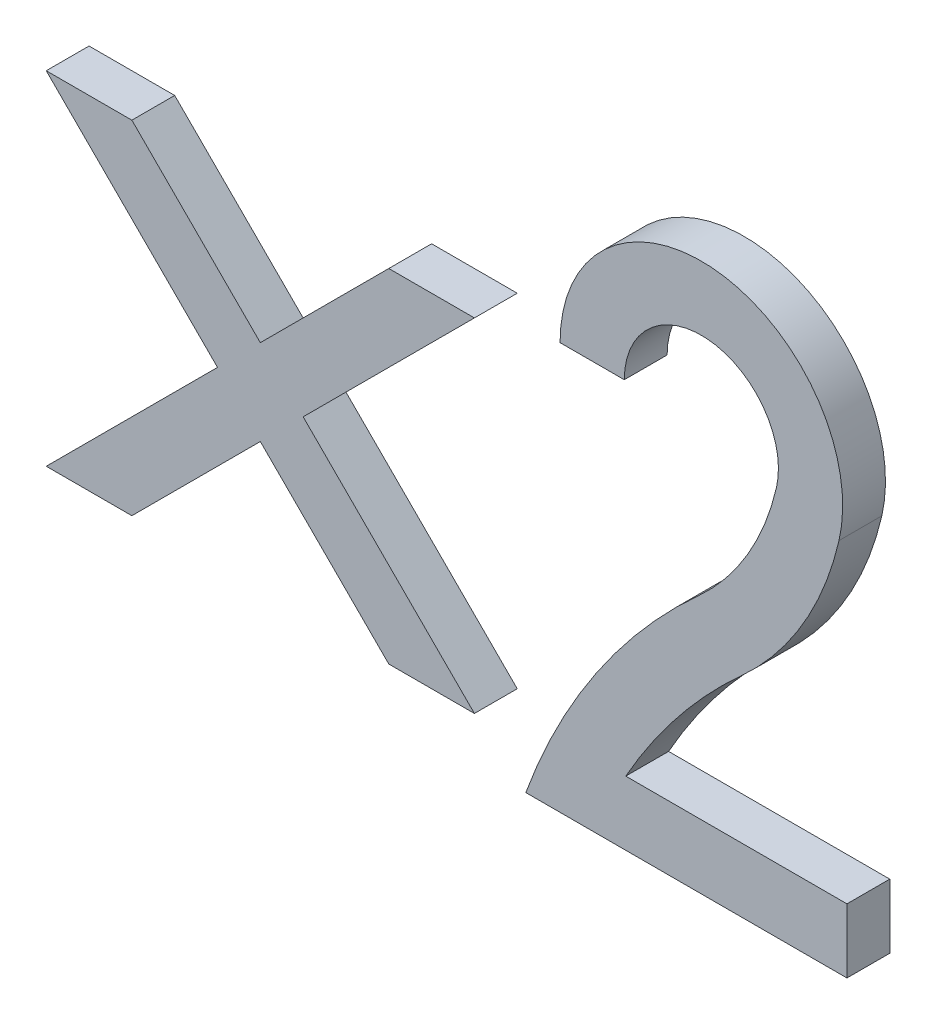
ISO-10303-21;
HEADER;
FILE_DESCRIPTION(('STEP AP214'),'2;1');
FILE_NAME('part.step','',(''),(''),'','','');
FILE_SCHEMA(('AUTOMOTIVE_DESIGN { 1 0 10303 214 1 1 1 1 }'));
ENDSEC;
DATA;
#1=APPLICATION_CONTEXT('core data for automotive mechanical design processes');
#2=APPLICATION_PROTOCOL_DEFINITION('international standard','automotive_design',2000,#1);
#3=PRODUCT_CONTEXT('',#1,'mechanical');
#4=PRODUCT('Part','Part','',(#3));
#5=PRODUCT_RELATED_PRODUCT_CATEGORY('part','',(#4));
#6=PRODUCT_DEFINITION_FORMATION('','',#4);
#7=PRODUCT_DEFINITION_CONTEXT('part definition',#1,'design');
#8=PRODUCT_DEFINITION('design','',#6,#7);
#9=PRODUCT_DEFINITION_SHAPE('','',#8);
#10=(LENGTH_UNIT() NAMED_UNIT(*) SI_UNIT(.MILLI.,.METRE.));
#11=(NAMED_UNIT(*) PLANE_ANGLE_UNIT() SI_UNIT($,.RADIAN.));
#12=(NAMED_UNIT(*) SI_UNIT($,.STERADIAN.) SOLID_ANGLE_UNIT());
#13=UNCERTAINTY_MEASURE_WITH_UNIT(LENGTH_MEASURE(1.E-05),#10,'distance_accuracy_value','');
#14=(GEOMETRIC_REPRESENTATION_CONTEXT(3) GLOBAL_UNCERTAINTY_ASSIGNED_CONTEXT((#13)) GLOBAL_UNIT_ASSIGNED_CONTEXT((#10,
#11,#12)) REPRESENTATION_CONTEXT('',''));
#15=CARTESIAN_POINT('',(0.,0.,0.));
#16=DIRECTION('',(0.,0.,1.));
#17=DIRECTION('',(1.,0.,0.));
#18=AXIS2_PLACEMENT_3D('',#15,#16,#17);
#19=CARTESIAN_POINT('',(103.,45.,10.));
#20=DIRECTION('',(0.,0.,-1.));
#21=DIRECTION('',(-1.,0.,0.));
#22=AXIS2_PLACEMENT_3D('',#19,#20,#21);
#23=CYLINDRICAL_SURFACE('',#22,18.);
#24=CARTESIAN_POINT('',(103.,45.,0.));
#25=DIRECTION('',(0.,0.,-1.));
#26=DIRECTION('',(-1.,0.,0.));
#27=AXIS2_PLACEMENT_3D('',#24,#25,#26);
#28=CIRCLE('',#27,18.);
#29=CARTESIAN_POINT('',(85.,45.,0.));
#30=VERTEX_POINT('',#29);
#31=CARTESIAN_POINT('',(120.53434356361,40.9322247120448,0.));
#32=VERTEX_POINT('',#31);
#33=EDGE_CURVE('E151',#30,#32,#28,.T.);
#34=ORIENTED_EDGE('',*,*,#33,.T.);
#35=DIRECTION('',(0.,0.,-1.));
#36=VECTOR('',#35,1.);
#37=CARTESIAN_POINT('',(120.53434356361,40.9322247120448,10.));
#38=LINE('',#37,#36);
#39=CARTESIAN_POINT('',(120.53434356361,40.9322247120448,10.));
#40=VERTEX_POINT('',#39);
#41=EDGE_CURVE('E12',#40,#32,#38,.T.);
#42=ORIENTED_EDGE('',*,*,#41,.F.);
#43=CARTESIAN_POINT('',(103.,45.,10.));
#44=DIRECTION('',(0.,0.,-1.));
#45=DIRECTION('',(-1.,0.,0.));
#46=AXIS2_PLACEMENT_3D('',#43,#44,#45);
#47=CIRCLE('',#46,18.);
#48=CARTESIAN_POINT('',(85.,45.,10.));
#49=VERTEX_POINT('',#48);
#50=EDGE_CURVE('E169',#49,#40,#47,.T.);
#51=ORIENTED_EDGE('',*,*,#50,.F.);
#52=DIRECTION('',(0.,0.,-1.));
#53=VECTOR('',#52,1.);
#54=CARTESIAN_POINT('',(85.,45.,10.));
#55=LINE('',#54,#53);
#56=EDGE_CURVE('E147',#49,#30,#55,.T.);
#57=ORIENTED_EDGE('',*,*,#56,.T.);
#58=EDGE_LOOP('',(#34,#42,#51,#57));
#59=FACE_BOUND('',#58,.T.);
#60=ADVANCED_FACE('F43',(#59),#23,.F.);
#61=CARTESIAN_POINT('',(62.0865316849107,54.4914756718954,10.));
#62=DIRECTION('',(0.,0.,-1.));
#63=DIRECTION('',(-1.,0.,0.));
#64=AXIS2_PLACEMENT_3D('',#61,#62,#63);
#65=CYLINDRICAL_SURFACE('',#64,60.);
#66=CARTESIAN_POINT('',(62.0865316849107,54.4914756718954,0.));
#67=DIRECTION('',(0.,0.,-1.));
#68=DIRECTION('',(-1.,0.,0.));
#69=AXIS2_PLACEMENT_3D('',#66,#67,#68);
#70=CIRCLE('',#69,60.);
#71=CARTESIAN_POINT('',(102.342072825692,9.99999999999999,0.));
#72=VERTEX_POINT('',#71);
#73=EDGE_CURVE('E154',#32,#72,#70,.T.);
#74=ORIENTED_EDGE('',*,*,#73,.T.);
#75=DIRECTION('',(0.,0.,-1.));
#76=VECTOR('',#75,1.);
#77=CARTESIAN_POINT('',(102.342072825692,9.99999999999999,10.));
#78=LINE('',#77,#76);
#79=CARTESIAN_POINT('',(102.342072825692,9.99999999999999,10.));
#80=VERTEX_POINT('',#79);
#81=EDGE_CURVE('E51',#80,#72,#78,.T.);
#82=ORIENTED_EDGE('',*,*,#81,.F.);
#83=CARTESIAN_POINT('',(62.0865316849107,54.4914756718954,10.));
#84=DIRECTION('',(0.,0.,-1.));
#85=DIRECTION('',(-1.,0.,0.));
#86=AXIS2_PLACEMENT_3D('',#83,#84,#85);
#87=CIRCLE('',#86,60.);
#88=EDGE_CURVE('E108',#40,#80,#87,.T.);
#89=ORIENTED_EDGE('',*,*,#88,.F.);
#90=ORIENTED_EDGE('',*,*,#41,.T.);
#91=EDGE_LOOP('',(#74,#82,#89,#90));
#92=FACE_BOUND('',#91,.T.);
#93=ADVANCED_FACE('F218',(#92),#65,.F.);
#94=CARTESIAN_POINT('',(202.980925677645,-101.228689179739,10.));
#95=DIRECTION('',(0.,0.,-1.));
#96=DIRECTION('',(-1.,0.,0.));
#97=AXIS2_PLACEMENT_3D('',#94,#95,#96);
#98=CYLINDRICAL_SURFACE('',#97,150.);
#99=CARTESIAN_POINT('',(202.980925677645,-101.228689179739,0.));
#100=DIRECTION('',(0.,0.,1.));
#101=DIRECTION('',(1.,0.,0.));
#102=AXIS2_PLACEMENT_3D('',#99,#100,#101);
#103=CIRCLE('',#102,150.);
#104=CARTESIAN_POINT('',(62.,-50.,0.));
#105=VERTEX_POINT('',#104);
#106=EDGE_CURVE('E156',#72,#105,#103,.T.);
#107=ORIENTED_EDGE('',*,*,#106,.T.);
#108=DIRECTION('',(0.,0.,-1.));
#109=VECTOR('',#108,1.);
#110=CARTESIAN_POINT('',(62.,-50.,10.));
#111=LINE('',#110,#109);
#112=CARTESIAN_POINT('',(62.,-50.,10.));
#113=VERTEX_POINT('',#112);
#114=EDGE_CURVE('E182',#113,#105,#111,.T.);
#115=ORIENTED_EDGE('',*,*,#114,.F.);
#116=CARTESIAN_POINT('',(202.980925677645,-101.228689179739,10.));
#117=DIRECTION('',(0.,0.,1.));
#118=DIRECTION('',(1.,0.,0.));
#119=AXIS2_PLACEMENT_3D('',#116,#117,#118);
#120=CIRCLE('',#119,150.);
#121=EDGE_CURVE('E190',#80,#113,#120,.T.);
#122=ORIENTED_EDGE('',*,*,#121,.F.);
#123=ORIENTED_EDGE('',*,*,#81,.T.);
#124=EDGE_LOOP('',(#107,#115,#122,#123));
#125=FACE_BOUND('',#124,.T.);
#126=ADVANCED_FACE('F188',(#125),#98,.T.);
#127=CARTESIAN_POINT('',(62.,-50.,10.));
#128=DIRECTION('',(0.,1.,0.));
#129=DIRECTION('',(0.,0.,1.));
#130=AXIS2_PLACEMENT_3D('',#127,#128,#129);
#131=PLANE('',#130);
#132=DIRECTION('',(1.,0.,0.));
#133=VECTOR('',#132,1.);
#134=CARTESIAN_POINT('',(62.,-50.,0.));
#135=LINE('',#134,#133);
#136=CARTESIAN_POINT('',(137.,-50.,0.));
#137=VERTEX_POINT('',#136);
#138=EDGE_CURVE('E158',#105,#137,#135,.T.);
#139=ORIENTED_EDGE('',*,*,#138,.T.);
#140=DIRECTION('',(0.,0.,-1.));
#141=VECTOR('',#140,1.);
#142=CARTESIAN_POINT('',(137.,-50.,10.));
#143=LINE('',#142,#141);
#144=CARTESIAN_POINT('',(137.,-50.,10.));
#145=VERTEX_POINT('',#144);
#146=EDGE_CURVE('E179',#145,#137,#143,.T.);
#147=ORIENTED_EDGE('',*,*,#146,.F.);
#148=DIRECTION('',(1.,0.,0.));
#149=VECTOR('',#148,1.);
#150=CARTESIAN_POINT('',(62.,-50.,10.));
#151=LINE('',#150,#149);
#152=EDGE_CURVE('E208',#113,#145,#151,.T.);
#153=ORIENTED_EDGE('',*,*,#152,.F.);
#154=ORIENTED_EDGE('',*,*,#114,.T.);
#155=EDGE_LOOP('',(#139,#147,#153,#154));
#156=FACE_BOUND('',#155,.T.);
#157=ADVANCED_FACE('F199',(#156),#131,.F.);
#158=CARTESIAN_POINT('',(137.,-50.,10.));
#159=DIRECTION('',(-1.,0.,0.));
#160=DIRECTION('',(0.,0.,1.));
#161=AXIS2_PLACEMENT_3D('',#158,#159,#160);
#162=PLANE('',#161);
#163=DIRECTION('',(0.,1.,0.));
#164=VECTOR('',#163,1.);
#165=CARTESIAN_POINT('',(137.,-50.,0.));
#166=LINE('',#165,#164);
#167=CARTESIAN_POINT('',(137.,-35.,0.));
#168=VERTEX_POINT('',#167);
#169=EDGE_CURVE('E160',#137,#168,#166,.T.);
#170=ORIENTED_EDGE('',*,*,#169,.T.);
#171=DIRECTION('',(0.,0.,-1.));
#172=VECTOR('',#171,1.);
#173=CARTESIAN_POINT('',(137.,-35.,10.));
#174=LINE('',#173,#172);
#175=CARTESIAN_POINT('',(137.,-35.,10.));
#176=VERTEX_POINT('',#175);
#177=EDGE_CURVE('E176',#176,#168,#174,.T.);
#178=ORIENTED_EDGE('',*,*,#177,.F.);
#179=DIRECTION('',(0.,1.,0.));
#180=VECTOR('',#179,1.);
#181=CARTESIAN_POINT('',(137.,-50.,10.));
#182=LINE('',#181,#180);
#183=EDGE_CURVE('E205',#145,#176,#182,.T.);
#184=ORIENTED_EDGE('',*,*,#183,.F.);
#185=ORIENTED_EDGE('',*,*,#146,.T.);
#186=EDGE_LOOP('',(#170,#178,#184,#185));
#187=FACE_BOUND('',#186,.T.);
#188=ADVANCED_FACE('F203',(#187),#162,.F.);
#189=CARTESIAN_POINT('',(85.3426634942316,-35.,10.));
#190=DIRECTION('',(0.,-1.,0.));
#191=DIRECTION('',(1.,0.,0.));
#192=AXIS2_PLACEMENT_3D('',#189,#190,#191);
#193=PLANE('',#192);
#194=DIRECTION('',(-1.,0.,0.));
#195=VECTOR('',#194,1.);
#196=CARTESIAN_POINT('',(85.3426634942316,-35.,0.));
#197=LINE('',#196,#195);
#198=CARTESIAN_POINT('',(85.3426634942316,-35.,0.));
#199=VERTEX_POINT('',#198);
#200=EDGE_CURVE('E162',#168,#199,#197,.T.);
#201=ORIENTED_EDGE('',*,*,#200,.T.);
#202=DIRECTION('',(0.,0.,-1.));
#203=VECTOR('',#202,1.);
#204=CARTESIAN_POINT('',(85.3426634942316,-35.,10.));
#205=LINE('',#204,#203);
#206=CARTESIAN_POINT('',(85.3426634942316,-35.,10.));
#207=VERTEX_POINT('',#206);
#208=EDGE_CURVE('E173',#207,#199,#205,.T.);
#209=ORIENTED_EDGE('',*,*,#208,.F.);
#210=DIRECTION('',(-1.,0.,0.));
#211=VECTOR('',#210,1.);
#212=CARTESIAN_POINT('',(85.3426634942316,-35.,10.));
#213=LINE('',#212,#211);
#214=EDGE_CURVE('E207',#176,#207,#213,.T.);
#215=ORIENTED_EDGE('',*,*,#214,.F.);
#216=ORIENTED_EDGE('',*,*,#177,.T.);
#217=EDGE_LOOP('',(#201,#209,#215,#216));
#218=FACE_BOUND('',#217,.T.);
#219=ADVANCED_FACE('F230',(#218),#193,.F.);
#220=CARTESIAN_POINT('',(202.980925677645,-101.228689179739,10.));
#221=DIRECTION('',(0.,0.,-1.));
#222=DIRECTION('',(-1.,0.,0.));
#223=AXIS2_PLACEMENT_3D('',#220,#221,#222);
#224=CYLINDRICAL_SURFACE('',#223,135.);
#225=CARTESIAN_POINT('',(202.980925677645,-101.228689179739,0.));
#226=DIRECTION('',(0.,0.,-1.));
#227=DIRECTION('',(1.,0.,0.));
#228=AXIS2_PLACEMENT_3D('',#225,#226,#227);
#229=CIRCLE('',#228,135.);
#230=CARTESIAN_POINT('',(112.405958110887,-1.1228689179739,0.));
#231=VERTEX_POINT('',#230);
#232=EDGE_CURVE('E164',#199,#231,#229,.T.);
#233=ORIENTED_EDGE('',*,*,#232,.T.);
#234=DIRECTION('',(0.,0.,-1.));
#235=VECTOR('',#234,1.);
#236=CARTESIAN_POINT('',(112.405958110887,-1.1228689179739,10.));
#237=LINE('',#236,#235);
#238=CARTESIAN_POINT('',(112.405958110887,-1.1228689179739,10.));
#239=VERTEX_POINT('',#238);
#240=EDGE_CURVE('E142',#239,#231,#237,.T.);
#241=ORIENTED_EDGE('',*,*,#240,.F.);
#242=CARTESIAN_POINT('',(202.980925677645,-101.228689179739,10.));
#243=DIRECTION('',(0.,0.,-1.));
#244=DIRECTION('',(1.,0.,0.));
#245=AXIS2_PLACEMENT_3D('',#242,#243,#244);
#246=CIRCLE('',#245,135.);
#247=EDGE_CURVE('E133',#207,#239,#246,.T.);
#248=ORIENTED_EDGE('',*,*,#247,.F.);
#249=ORIENTED_EDGE('',*,*,#208,.T.);
#250=EDGE_LOOP('',(#233,#241,#248,#249));
#251=FACE_BOUND('',#250,.T.);
#252=ADVANCED_FACE('F233',(#251),#224,.F.);
#253=CARTESIAN_POINT('',(62.0865316849107,54.4914756718954,10.));
#254=DIRECTION('',(0.,0.,-1.));
#255=DIRECTION('',(-1.,0.,0.));
#256=AXIS2_PLACEMENT_3D('',#253,#254,#255);
#257=CYLINDRICAL_SURFACE('',#256,75.);
#258=CARTESIAN_POINT('',(62.0865316849107,54.4914756718954,0.));
#259=DIRECTION('',(0.,0.,1.));
#260=DIRECTION('',(-1.,0.,0.));
#261=AXIS2_PLACEMENT_3D('',#258,#259,#260);
#262=CIRCLE('',#261,75.);
#263=CARTESIAN_POINT('',(135.146296533284,37.5424119720821,0.));
#264=VERTEX_POINT('',#263);
#265=EDGE_CURVE('E141',#231,#264,#262,.T.);
#266=ORIENTED_EDGE('',*,*,#265,.T.);
#267=DIRECTION('',(0.,0.,-1.));
#268=VECTOR('',#267,1.);
#269=CARTESIAN_POINT('',(135.146296533284,37.5424119720821,10.));
#270=LINE('',#269,#268);
#271=CARTESIAN_POINT('',(135.146296533284,37.5424119720821,10.));
#272=VERTEX_POINT('',#271);
#273=EDGE_CURVE('E138',#272,#264,#270,.T.);
#274=ORIENTED_EDGE('',*,*,#273,.F.);
#275=CARTESIAN_POINT('',(62.0865316849107,54.4914756718954,10.));
#276=DIRECTION('',(0.,0.,1.));
#277=DIRECTION('',(-1.,0.,0.));
#278=AXIS2_PLACEMENT_3D('',#275,#276,#277);
#279=CIRCLE('',#278,75.);
#280=EDGE_CURVE('E127',#239,#272,#279,.T.);
#281=ORIENTED_EDGE('',*,*,#280,.F.);
#282=ORIENTED_EDGE('',*,*,#240,.T.);
#283=EDGE_LOOP('',(#266,#274,#281,#282));
#284=FACE_BOUND('',#283,.T.);
#285=ADVANCED_FACE('F139',(#284),#257,.T.);
#286=CARTESIAN_POINT('',(103.,45.,10.));
#287=DIRECTION('',(0.,0.,-1.));
#288=DIRECTION('',(-1.,0.,0.));
#289=AXIS2_PLACEMENT_3D('',#286,#287,#288);
#290=CYLINDRICAL_SURFACE('',#289,33.);
#291=CARTESIAN_POINT('',(103.,45.,0.));
#292=DIRECTION('',(0.,0.,1.));
#293=DIRECTION('',(-1.,0.,0.));
#294=AXIS2_PLACEMENT_3D('',#291,#292,#293);
#295=CIRCLE('',#294,33.);
#296=CARTESIAN_POINT('',(70.,45.,0.));
#297=VERTEX_POINT('',#296);
#298=EDGE_CURVE('E94',#264,#297,#295,.T.);
#299=ORIENTED_EDGE('',*,*,#298,.T.);
#300=DIRECTION('',(0.,0.,-1.));
#301=VECTOR('',#300,1.);
#302=CARTESIAN_POINT('',(70.,45.,10.));
#303=LINE('',#302,#301);
#304=CARTESIAN_POINT('',(70.,45.,10.));
#305=VERTEX_POINT('',#304);
#306=EDGE_CURVE('E143',#305,#297,#303,.T.);
#307=ORIENTED_EDGE('',*,*,#306,.F.);
#308=CARTESIAN_POINT('',(103.,45.,10.));
#309=DIRECTION('',(0.,0.,1.));
#310=DIRECTION('',(-1.,0.,0.));
#311=AXIS2_PLACEMENT_3D('',#308,#309,#310);
#312=CIRCLE('',#311,33.);
#313=EDGE_CURVE('E131',#272,#305,#312,.T.);
#314=ORIENTED_EDGE('',*,*,#313,.F.);
#315=ORIENTED_EDGE('',*,*,#273,.T.);
#316=EDGE_LOOP('',(#299,#307,#314,#315));
#317=FACE_BOUND('',#316,.T.);
#318=ADVANCED_FACE('F145',(#317),#290,.T.);
#319=CARTESIAN_POINT('',(70.,45.,10.));
#320=DIRECTION('',(0.,1.,0.));
#321=DIRECTION('',(-1.,0.,0.));
#322=AXIS2_PLACEMENT_3D('',#319,#320,#321);
#323=PLANE('',#322);
#324=DIRECTION('',(1.,0.,0.));
#325=VECTOR('',#324,1.);
#326=CARTESIAN_POINT('',(70.,45.,0.));
#327=LINE('',#326,#325);
#328=EDGE_CURVE('E100',#297,#30,#327,.T.);
#329=ORIENTED_EDGE('',*,*,#328,.T.);
#330=ORIENTED_EDGE('',*,*,#56,.F.);
#331=DIRECTION('',(1.,0.,0.));
#332=VECTOR('',#331,1.);
#333=CARTESIAN_POINT('',(70.,45.,10.));
#334=LINE('',#333,#332);
#335=EDGE_CURVE('E59',#305,#49,#334,.T.);
#336=ORIENTED_EDGE('',*,*,#335,.F.);
#337=ORIENTED_EDGE('',*,*,#306,.T.);
#338=EDGE_LOOP('',(#329,#330,#336,#337));
#339=FACE_BOUND('',#338,.T.);
#340=ADVANCED_FACE('F242',(#339),#323,.F.);
#341=CARTESIAN_POINT('',(103.,45.,10.));
#342=DIRECTION('',(0.,0.,-1.));
#343=DIRECTION('',(-1.,0.,0.));
#344=AXIS2_PLACEMENT_3D('',#341,#342,#343);
#345=PLANE('',#344);
#346=ORIENTED_EDGE('',*,*,#50,.T.);
#347=ORIENTED_EDGE('',*,*,#88,.T.);
#348=ORIENTED_EDGE('',*,*,#121,.T.);
#349=ORIENTED_EDGE('',*,*,#152,.T.);
#350=ORIENTED_EDGE('',*,*,#183,.T.);
#351=ORIENTED_EDGE('',*,*,#214,.T.);
#352=ORIENTED_EDGE('',*,*,#247,.T.);
#353=ORIENTED_EDGE('',*,*,#280,.T.);
#354=ORIENTED_EDGE('',*,*,#313,.T.);
#355=ORIENTED_EDGE('',*,*,#335,.T.);
#356=EDGE_LOOP('',(#346,#347,#348,#349,#350,#351,#352,#353,#354,#355));
#357=FACE_BOUND('',#356,.T.);
#358=ADVANCED_FACE('F129',(#357),#345,.F.);
#359=CARTESIAN_POINT('',(103.,45.,0.));
#360=DIRECTION('',(0.,0.,-1.));
#361=DIRECTION('',(-1.,0.,0.));
#362=AXIS2_PLACEMENT_3D('',#359,#360,#361);
#363=PLANE('',#362);
#364=ORIENTED_EDGE('',*,*,#33,.F.);
#365=ORIENTED_EDGE('',*,*,#328,.F.);
#366=ORIENTED_EDGE('',*,*,#298,.F.);
#367=ORIENTED_EDGE('',*,*,#265,.F.);
#368=ORIENTED_EDGE('',*,*,#232,.F.);
#369=ORIENTED_EDGE('',*,*,#200,.F.);
#370=ORIENTED_EDGE('',*,*,#169,.F.);
#371=ORIENTED_EDGE('',*,*,#138,.F.);
#372=ORIENTED_EDGE('',*,*,#106,.F.);
#373=ORIENTED_EDGE('',*,*,#73,.F.);
#374=EDGE_LOOP('',(#364,#365,#366,#367,#368,#369,#370,#371,#372,#373));
#375=FACE_BOUND('',#374,.T.);
#376=ADVANCED_FACE('F194',(#375),#363,.T.);
#377=CLOSED_SHELL('',(#60,#93,#126,#157,#188,#219,#252,#285,#318,#340,#358,#376));
#378=MANIFOLD_SOLID_BREP('B2',#377);
#379=CARTESIAN_POINT('',(-30.,40.,10.));
#380=DIRECTION('',(0.,-1.,0.));
#381=DIRECTION('',(0.,0.,-1.));
#382=AXIS2_PLACEMENT_3D('',#379,#380,#381);
#383=PLANE('',#382);
#384=DIRECTION('',(-1.,0.,0.));
#385=VECTOR('',#384,1.);
#386=CARTESIAN_POINT('',(-30.,40.,0.));
#387=LINE('',#386,#385);
#388=CARTESIAN_POINT('',(-30.,40.,0.));
#389=VERTEX_POINT('',#388);
#390=CARTESIAN_POINT('',(-50.,40.,0.));
#391=VERTEX_POINT('',#390);
#392=EDGE_CURVE('E443',#389,#391,#387,.T.);
#393=ORIENTED_EDGE('',*,*,#392,.T.);
#394=DIRECTION('',(0.,0.,-1.));
#395=VECTOR('',#394,1.);
#396=CARTESIAN_POINT('',(-50.,40.,10.));
#397=LINE('',#396,#395);
#398=CARTESIAN_POINT('',(-50.,40.,10.));
#399=VERTEX_POINT('',#398);
#400=EDGE_CURVE('E41',#399,#391,#397,.T.);
#401=ORIENTED_EDGE('',*,*,#400,.F.);
#402=DIRECTION('',(-1.,0.,0.));
#403=VECTOR('',#402,1.);
#404=CARTESIAN_POINT('',(-30.,40.,10.));
#405=LINE('',#404,#403);
#406=CARTESIAN_POINT('',(-30.,40.,10.));
#407=VERTEX_POINT('',#406);
#408=EDGE_CURVE('E465',#407,#399,#405,.T.);
#409=ORIENTED_EDGE('',*,*,#408,.F.);
#410=DIRECTION('',(0.,0.,-1.));
#411=VECTOR('',#410,1.);
#412=CARTESIAN_POINT('',(-30.,40.,10.));
#413=LINE('',#412,#411);
#414=EDGE_CURVE('E439',#407,#389,#413,.T.);
#415=ORIENTED_EDGE('',*,*,#414,.T.);
#416=EDGE_LOOP('',(#393,#401,#409,#415));
#417=FACE_BOUND('',#416,.T.);
#418=ADVANCED_FACE('F323',(#417),#383,.F.);
#419=CARTESIAN_POINT('',(-50.,40.,10.));
#420=DIRECTION('',(0.707106781186547,0.707106781186548,0.));
#421=DIRECTION('',(-0.707106781186548,0.707106781186547,0.));
#422=AXIS2_PLACEMENT_3D('',#419,#420,#421);
#423=PLANE('',#422);
#424=DIRECTION('',(0.707106781186548,-0.707106781186547,0.));
#425=VECTOR('',#424,1.);
#426=CARTESIAN_POINT('',(-50.,40.,0.));
#427=LINE('',#426,#425);
#428=CARTESIAN_POINT('',(-10.,0.,0.));
#429=VERTEX_POINT('',#428);
#430=EDGE_CURVE('E446',#391,#429,#427,.T.);
#431=ORIENTED_EDGE('',*,*,#430,.T.);
#432=DIRECTION('',(0.,0.,-1.));
#433=VECTOR('',#432,1.);
#434=CARTESIAN_POINT('',(-10.,0.,10.));
#435=LINE('',#434,#433);
#436=CARTESIAN_POINT('',(-10.,0.,10.));
#437=VERTEX_POINT('',#436);
#438=EDGE_CURVE('E331',#437,#429,#435,.T.);
#439=ORIENTED_EDGE('',*,*,#438,.F.);
#440=DIRECTION('',(0.707106781186548,-0.707106781186547,0.));
#441=VECTOR('',#440,1.);
#442=CARTESIAN_POINT('',(-50.,40.,10.));
#443=LINE('',#442,#441);
#444=EDGE_CURVE('E394',#399,#437,#443,.T.);
#445=ORIENTED_EDGE('',*,*,#444,.F.);
#446=ORIENTED_EDGE('',*,*,#400,.T.);
#447=EDGE_LOOP('',(#431,#439,#445,#446));
#448=FACE_BOUND('',#447,.T.);
#449=ADVANCED_FACE('F543',(#448),#423,.F.);
#450=CARTESIAN_POINT('',(-50.,-40.,10.));
#451=DIRECTION('',(0.707106781186548,-0.707106781186548,0.));
#452=DIRECTION('',(0.707106781186548,0.707106781186548,0.));
#453=AXIS2_PLACEMENT_3D('',#450,#451,#452);
#454=PLANE('',#453);
#455=DIRECTION('',(-0.707106781186547,-0.707106781186547,0.));
#456=VECTOR('',#455,1.);
#457=CARTESIAN_POINT('',(-50.,-40.,0.));
#458=LINE('',#457,#456);
#459=CARTESIAN_POINT('',(-50.,-40.,0.));
#460=VERTEX_POINT('',#459);
#461=EDGE_CURVE('E448',#429,#460,#458,.T.);
#462=ORIENTED_EDGE('',*,*,#461,.T.);
#463=DIRECTION('',(0.,0.,-1.));
#464=VECTOR('',#463,1.);
#465=CARTESIAN_POINT('',(-50.,-40.,10.));
#466=LINE('',#465,#464);
#467=CARTESIAN_POINT('',(-50.,-40.,10.));
#468=VERTEX_POINT('',#467);
#469=EDGE_CURVE('E484',#468,#460,#466,.T.);
#470=ORIENTED_EDGE('',*,*,#469,.F.);
#471=DIRECTION('',(-0.707106781186547,-0.707106781186547,0.));
#472=VECTOR('',#471,1.);
#473=CARTESIAN_POINT('',(-50.,-40.,10.));
#474=LINE('',#473,#472);
#475=EDGE_CURVE('E492',#437,#468,#474,.T.);
#476=ORIENTED_EDGE('',*,*,#475,.F.);
#477=ORIENTED_EDGE('',*,*,#438,.T.);
#478=EDGE_LOOP('',(#462,#470,#476,#477));
#479=FACE_BOUND('',#478,.T.);
#480=ADVANCED_FACE('F490',(#479),#454,.F.);
#481=CARTESIAN_POINT('',(-29.9999999999999,-40.,10.));
#482=DIRECTION('',(0.,1.,0.));
#483=DIRECTION('',(0.,0.,1.));
#484=AXIS2_PLACEMENT_3D('',#481,#482,#483);
#485=PLANE('',#484);
#486=DIRECTION('',(1.,0.,0.));
#487=VECTOR('',#486,1.);
#488=CARTESIAN_POINT('',(-29.9999999999999,-40.,0.));
#489=LINE('',#488,#487);
#490=CARTESIAN_POINT('',(-29.9999999999999,-40.,0.));
#491=VERTEX_POINT('',#490);
#492=EDGE_CURVE('E450',#460,#491,#489,.T.);
#493=ORIENTED_EDGE('',*,*,#492,.T.);
#494=DIRECTION('',(0.,0.,-1.));
#495=VECTOR('',#494,1.);
#496=CARTESIAN_POINT('',(-29.9999999999999,-40.,10.));
#497=LINE('',#496,#495);
#498=CARTESIAN_POINT('',(-29.9999999999999,-40.,10.));
#499=VERTEX_POINT('',#498);
#500=EDGE_CURVE('E481',#499,#491,#497,.T.);
#501=ORIENTED_EDGE('',*,*,#500,.F.);
#502=DIRECTION('',(1.,0.,0.));
#503=VECTOR('',#502,1.);
#504=CARTESIAN_POINT('',(-29.9999999999999,-40.,10.));
#505=LINE('',#504,#503);
#506=EDGE_CURVE('E510',#468,#499,#505,.T.);
#507=ORIENTED_EDGE('',*,*,#506,.F.);
#508=ORIENTED_EDGE('',*,*,#469,.T.);
#509=EDGE_LOOP('',(#493,#501,#507,#508));
#510=FACE_BOUND('',#509,.T.);
#511=ADVANCED_FACE('F501',(#510),#485,.F.);
#512=CARTESIAN_POINT('',(0.,-10.,10.));
#513=DIRECTION('',(-0.707106781186548,0.707106781186547,0.));
#514=DIRECTION('',(-0.707106781186547,-0.707106781186548,0.));
#515=AXIS2_PLACEMENT_3D('',#512,#513,#514);
#516=PLANE('',#515);
#517=DIRECTION('',(0.707106781186547,0.707106781186548,0.));
#518=VECTOR('',#517,1.);
#519=CARTESIAN_POINT('',(0.,-10.,0.));
#520=LINE('',#519,#518);
#521=CARTESIAN_POINT('',(0.,-10.,0.));
#522=VERTEX_POINT('',#521);
#523=EDGE_CURVE('E452',#491,#522,#520,.T.);
#524=ORIENTED_EDGE('',*,*,#523,.T.);
#525=DIRECTION('',(0.,0.,-1.));
#526=VECTOR('',#525,1.);
#527=CARTESIAN_POINT('',(0.,-10.,10.));
#528=LINE('',#527,#526);
#529=CARTESIAN_POINT('',(0.,-10.,10.));
#530=VERTEX_POINT('',#529);
#531=EDGE_CURVE('E478',#530,#522,#528,.T.);
#532=ORIENTED_EDGE('',*,*,#531,.F.);
#533=DIRECTION('',(0.707106781186547,0.707106781186548,0.));
#534=VECTOR('',#533,1.);
#535=CARTESIAN_POINT('',(0.,-10.,10.));
#536=LINE('',#535,#534);
#537=EDGE_CURVE('E507',#499,#530,#536,.T.);
#538=ORIENTED_EDGE('',*,*,#537,.F.);
#539=ORIENTED_EDGE('',*,*,#500,.T.);
#540=EDGE_LOOP('',(#524,#532,#538,#539));
#541=FACE_BOUND('',#540,.T.);
#542=ADVANCED_FACE('F505',(#541),#516,.F.);
#543=CARTESIAN_POINT('',(0.,-10.,10.));
#544=DIRECTION('',(0.707106781186548,0.707106781186547,0.));
#545=DIRECTION('',(-0.707106781186547,0.707106781186548,0.));
#546=AXIS2_PLACEMENT_3D('',#543,#544,#545);
#547=PLANE('',#546);
#548=DIRECTION('',(0.707106781186547,-0.707106781186548,0.));
#549=VECTOR('',#548,1.);
#550=CARTESIAN_POINT('',(0.,-10.,0.));
#551=LINE('',#550,#549);
#552=CARTESIAN_POINT('',(30.,-40.,0.));
#553=VERTEX_POINT('',#552);
#554=EDGE_CURVE('E454',#522,#553,#551,.T.);
#555=ORIENTED_EDGE('',*,*,#554,.T.);
#556=DIRECTION('',(0.,0.,-1.));
#557=VECTOR('',#556,1.);
#558=CARTESIAN_POINT('',(30.,-40.,10.));
#559=LINE('',#558,#557);
#560=CARTESIAN_POINT('',(30.,-40.,10.));
#561=VERTEX_POINT('',#560);
#562=EDGE_CURVE('E475',#561,#553,#559,.T.);
#563=ORIENTED_EDGE('',*,*,#562,.F.);
#564=DIRECTION('',(0.707106781186547,-0.707106781186548,0.));
#565=VECTOR('',#564,1.);
#566=CARTESIAN_POINT('',(0.,-10.,10.));
#567=LINE('',#566,#565);
#568=EDGE_CURVE('E509',#530,#561,#567,.T.);
#569=ORIENTED_EDGE('',*,*,#568,.F.);
#570=ORIENTED_EDGE('',*,*,#531,.T.);
#571=EDGE_LOOP('',(#555,#563,#569,#570));
#572=FACE_BOUND('',#571,.T.);
#573=ADVANCED_FACE('F556',(#572),#547,.F.);
#574=CARTESIAN_POINT('',(30.,-40.,10.));
#575=DIRECTION('',(0.,1.,0.));
#576=DIRECTION('',(0.,0.,1.));
#577=AXIS2_PLACEMENT_3D('',#574,#575,#576);
#578=PLANE('',#577);
#579=DIRECTION('',(1.,0.,0.));
#580=VECTOR('',#579,1.);
#581=CARTESIAN_POINT('',(30.,-40.,0.));
#582=LINE('',#581,#580);
#583=CARTESIAN_POINT('',(50.,-40.,0.));
#584=VERTEX_POINT('',#583);
#585=EDGE_CURVE('E456',#553,#584,#582,.T.);
#586=ORIENTED_EDGE('',*,*,#585,.T.);
#587=DIRECTION('',(0.,0.,-1.));
#588=VECTOR('',#587,1.);
#589=CARTESIAN_POINT('',(50.,-40.,10.));
#590=LINE('',#589,#588);
#591=CARTESIAN_POINT('',(50.,-40.,10.));
#592=VERTEX_POINT('',#591);
#593=EDGE_CURVE('E472',#592,#584,#590,.T.);
#594=ORIENTED_EDGE('',*,*,#593,.F.);
#595=DIRECTION('',(1.,0.,0.));
#596=VECTOR('',#595,1.);
#597=CARTESIAN_POINT('',(30.,-40.,10.));
#598=LINE('',#597,#596);
#599=EDGE_CURVE('E512',#561,#592,#598,.T.);
#600=ORIENTED_EDGE('',*,*,#599,.F.);
#601=ORIENTED_EDGE('',*,*,#562,.T.);
#602=EDGE_LOOP('',(#586,#594,#600,#601));
#603=FACE_BOUND('',#602,.T.);
#604=ADVANCED_FACE('F559',(#603),#578,.F.);
#605=CARTESIAN_POINT('',(50.,-40.,10.));
#606=DIRECTION('',(-0.707106781186547,-0.707106781186548,0.));
#607=DIRECTION('',(0.707106781186548,-0.707106781186547,0.));
#608=AXIS2_PLACEMENT_3D('',#605,#606,#607);
#609=PLANE('',#608);
#610=DIRECTION('',(-0.707106781186548,0.707106781186547,0.));
#611=VECTOR('',#610,1.);
#612=CARTESIAN_POINT('',(50.,-40.,0.));
#613=LINE('',#612,#611);
#614=CARTESIAN_POINT('',(10.,0.,0.));
#615=VERTEX_POINT('',#614);
#616=EDGE_CURVE('E458',#584,#615,#613,.T.);
#617=ORIENTED_EDGE('',*,*,#616,.T.);
#618=DIRECTION('',(0.,0.,-1.));
#619=VECTOR('',#618,1.);
#620=CARTESIAN_POINT('',(10.,0.,10.));
#621=LINE('',#620,#619);
#622=CARTESIAN_POINT('',(10.,0.,10.));
#623=VERTEX_POINT('',#622);
#624=EDGE_CURVE('E469',#623,#615,#621,.T.);
#625=ORIENTED_EDGE('',*,*,#624,.F.);
#626=DIRECTION('',(-0.707106781186548,0.707106781186547,0.));
#627=VECTOR('',#626,1.);
#628=CARTESIAN_POINT('',(50.,-40.,10.));
#629=LINE('',#628,#627);
#630=EDGE_CURVE('E518',#592,#623,#629,.T.);
#631=ORIENTED_EDGE('',*,*,#630,.F.);
#632=ORIENTED_EDGE('',*,*,#593,.T.);
#633=EDGE_LOOP('',(#617,#625,#631,#632));
#634=FACE_BOUND('',#633,.T.);
#635=ADVANCED_FACE('F524',(#634),#609,.F.);
#636=CARTESIAN_POINT('',(50.,40.,10.));
#637=DIRECTION('',(-0.707106781186548,0.707106781186547,0.));
#638=DIRECTION('',(-0.707106781186547,-0.707106781186548,0.));
#639=AXIS2_PLACEMENT_3D('',#636,#637,#638);
#640=PLANE('',#639);
#641=DIRECTION('',(0.707106781186547,0.707106781186548,0.));
#642=VECTOR('',#641,1.);
#643=CARTESIAN_POINT('',(50.,40.,0.));
#644=LINE('',#643,#642);
#645=CARTESIAN_POINT('',(50.,40.,0.));
#646=VERTEX_POINT('',#645);
#647=EDGE_CURVE('E460',#615,#646,#644,.T.);
#648=ORIENTED_EDGE('',*,*,#647,.T.);
#649=DIRECTION('',(0.,0.,-1.));
#650=VECTOR('',#649,1.);
#651=CARTESIAN_POINT('',(50.,40.,10.));
#652=LINE('',#651,#650);
#653=CARTESIAN_POINT('',(50.,40.,10.));
#654=VERTEX_POINT('',#653);
#655=EDGE_CURVE('E434',#654,#646,#652,.T.);
#656=ORIENTED_EDGE('',*,*,#655,.F.);
#657=DIRECTION('',(0.707106781186547,0.707106781186548,0.));
#658=VECTOR('',#657,1.);
#659=CARTESIAN_POINT('',(50.,40.,10.));
#660=LINE('',#659,#658);
#661=EDGE_CURVE('E425',#623,#654,#660,.T.);
#662=ORIENTED_EDGE('',*,*,#661,.F.);
#663=ORIENTED_EDGE('',*,*,#624,.T.);
#664=EDGE_LOOP('',(#648,#656,#662,#663));
#665=FACE_BOUND('',#664,.T.);
#666=ADVANCED_FACE('F528',(#665),#640,.F.);
#667=CARTESIAN_POINT('',(30.,40.,10.));
#668=DIRECTION('',(0.,-1.,0.));
#669=DIRECTION('',(0.,0.,-1.));
#670=AXIS2_PLACEMENT_3D('',#667,#668,#669);
#671=PLANE('',#670);
#672=DIRECTION('',(-1.,0.,0.));
#673=VECTOR('',#672,1.);
#674=CARTESIAN_POINT('',(30.,40.,0.));
#675=LINE('',#674,#673);
#676=CARTESIAN_POINT('',(30.,40.,0.));
#677=VERTEX_POINT('',#676);
#678=EDGE_CURVE('E433',#646,#677,#675,.T.);
#679=ORIENTED_EDGE('',*,*,#678,.T.);
#680=DIRECTION('',(0.,0.,-1.));
#681=VECTOR('',#680,1.);
#682=CARTESIAN_POINT('',(30.,40.,10.));
#683=LINE('',#682,#681);
#684=CARTESIAN_POINT('',(30.,40.,10.));
#685=VERTEX_POINT('',#684);
#686=EDGE_CURVE('E430',#685,#677,#683,.T.);
#687=ORIENTED_EDGE('',*,*,#686,.F.);
#688=DIRECTION('',(-1.,0.,0.));
#689=VECTOR('',#688,1.);
#690=CARTESIAN_POINT('',(30.,40.,10.));
#691=LINE('',#690,#689);
#692=EDGE_CURVE('E419',#654,#685,#691,.T.);
#693=ORIENTED_EDGE('',*,*,#692,.F.);
#694=ORIENTED_EDGE('',*,*,#655,.T.);
#695=EDGE_LOOP('',(#679,#687,#693,#694));
#696=FACE_BOUND('',#695,.T.);
#697=ADVANCED_FACE('F431',(#696),#671,.F.);
#698=CARTESIAN_POINT('',(0.,10.,10.));
#699=DIRECTION('',(0.707106781186548,-0.707106781186547,0.));
#700=DIRECTION('',(0.707106781186547,0.707106781186548,0.));
#701=AXIS2_PLACEMENT_3D('',#698,#699,#700);
#702=PLANE('',#701);
#703=DIRECTION('',(-0.707106781186547,-0.707106781186548,0.));
#704=VECTOR('',#703,1.);
#705=CARTESIAN_POINT('',(0.,10.,0.));
#706=LINE('',#705,#704);
#707=CARTESIAN_POINT('',(0.,10.,0.));
#708=VERTEX_POINT('',#707);
#709=EDGE_CURVE('E380',#677,#708,#706,.T.);
#710=ORIENTED_EDGE('',*,*,#709,.T.);
#711=DIRECTION('',(0.,0.,-1.));
#712=VECTOR('',#711,1.);
#713=CARTESIAN_POINT('',(0.,10.,10.));
#714=LINE('',#713,#712);
#715=CARTESIAN_POINT('',(0.,10.,10.));
#716=VERTEX_POINT('',#715);
#717=EDGE_CURVE('E435',#716,#708,#714,.T.);
#718=ORIENTED_EDGE('',*,*,#717,.F.);
#719=DIRECTION('',(-0.707106781186547,-0.707106781186548,0.));
#720=VECTOR('',#719,1.);
#721=CARTESIAN_POINT('',(0.,10.,10.));
#722=LINE('',#721,#720);
#723=EDGE_CURVE('E423',#685,#716,#722,.T.);
#724=ORIENTED_EDGE('',*,*,#723,.F.);
#725=ORIENTED_EDGE('',*,*,#686,.T.);
#726=EDGE_LOOP('',(#710,#718,#724,#725));
#727=FACE_BOUND('',#726,.T.);
#728=ADVANCED_FACE('F437',(#727),#702,.F.);
#729=CARTESIAN_POINT('',(0.,10.,10.));
#730=DIRECTION('',(-0.707106781186547,-0.707106781186548,0.));
#731=DIRECTION('',(0.707106781186548,-0.707106781186547,0.));
#732=AXIS2_PLACEMENT_3D('',#729,#730,#731);
#733=PLANE('',#732);
#734=DIRECTION('',(-0.707106781186548,0.707106781186547,0.));
#735=VECTOR('',#734,1.);
#736=CARTESIAN_POINT('',(0.,10.,0.));
#737=LINE('',#736,#735);
#738=EDGE_CURVE('E386',#708,#389,#737,.T.);
#739=ORIENTED_EDGE('',*,*,#738,.T.);
#740=ORIENTED_EDGE('',*,*,#414,.F.);
#741=DIRECTION('',(-0.707106781186548,0.707106781186547,0.));
#742=VECTOR('',#741,1.);
#743=CARTESIAN_POINT('',(0.,10.,10.));
#744=LINE('',#743,#742);
#745=EDGE_CURVE('E339',#716,#407,#744,.T.);
#746=ORIENTED_EDGE('',*,*,#745,.F.);
#747=ORIENTED_EDGE('',*,*,#717,.T.);
#748=EDGE_LOOP('',(#739,#740,#746,#747));
#749=FACE_BOUND('',#748,.T.);
#750=ADVANCED_FACE('F532',(#749),#733,.F.);
#751=CARTESIAN_POINT('',(0.,0.,10.));
#752=DIRECTION('',(0.,0.,1.));
#753=DIRECTION('',(1.,0.,0.));
#754=AXIS2_PLACEMENT_3D('',#751,#752,#753);
#755=PLANE('',#754);
#756=ORIENTED_EDGE('',*,*,#408,.T.);
#757=ORIENTED_EDGE('',*,*,#444,.T.);
#758=ORIENTED_EDGE('',*,*,#475,.T.);
#759=ORIENTED_EDGE('',*,*,#506,.T.);
#760=ORIENTED_EDGE('',*,*,#537,.T.);
#761=ORIENTED_EDGE('',*,*,#568,.T.);
#762=ORIENTED_EDGE('',*,*,#599,.T.);
#763=ORIENTED_EDGE('',*,*,#630,.T.);
#764=ORIENTED_EDGE('',*,*,#661,.T.);
#765=ORIENTED_EDGE('',*,*,#692,.T.);
#766=ORIENTED_EDGE('',*,*,#723,.T.);
#767=ORIENTED_EDGE('',*,*,#745,.T.);
#768=EDGE_LOOP('',(#756,#757,#758,#759,#760,#761,#762,#763,#764,#765,#766,#767));
#769=FACE_BOUND('',#768,.T.);
#770=ADVANCED_FACE('F421',(#769),#755,.T.);
#771=CARTESIAN_POINT('',(0.,0.,0.));
#772=DIRECTION('',(0.,0.,1.));
#773=DIRECTION('',(1.,0.,0.));
#774=AXIS2_PLACEMENT_3D('',#771,#772,#773);
#775=PLANE('',#774);
#776=ORIENTED_EDGE('',*,*,#392,.F.);
#777=ORIENTED_EDGE('',*,*,#738,.F.);
#778=ORIENTED_EDGE('',*,*,#709,.F.);
#779=ORIENTED_EDGE('',*,*,#678,.F.);
#780=ORIENTED_EDGE('',*,*,#647,.F.);
#781=ORIENTED_EDGE('',*,*,#616,.F.);
#782=ORIENTED_EDGE('',*,*,#585,.F.);
#783=ORIENTED_EDGE('',*,*,#554,.F.);
#784=ORIENTED_EDGE('',*,*,#523,.F.);
#785=ORIENTED_EDGE('',*,*,#492,.F.);
#786=ORIENTED_EDGE('',*,*,#461,.F.);
#787=ORIENTED_EDGE('',*,*,#430,.F.);
#788=EDGE_LOOP('',(#776,#777,#778,#779,#780,#781,#782,#783,#784,#785,#786,#787));
#789=FACE_BOUND('',#788,.T.);
#790=ADVANCED_FACE('F496',(#789),#775,.F.);
#791=CLOSED_SHELL('',(#418,#449,#480,#511,#542,#573,#604,#635,#666,#697,#728,#750,#770,#790));
#792=MANIFOLD_SOLID_BREP('B6',#791);
#793=ADVANCED_BREP_SHAPE_REPRESENTATION('',(#18,#378,#792),#14);
#794=SHAPE_DEFINITION_REPRESENTATION(#9,#793);
ENDSEC;
END-ISO-10303-21;
